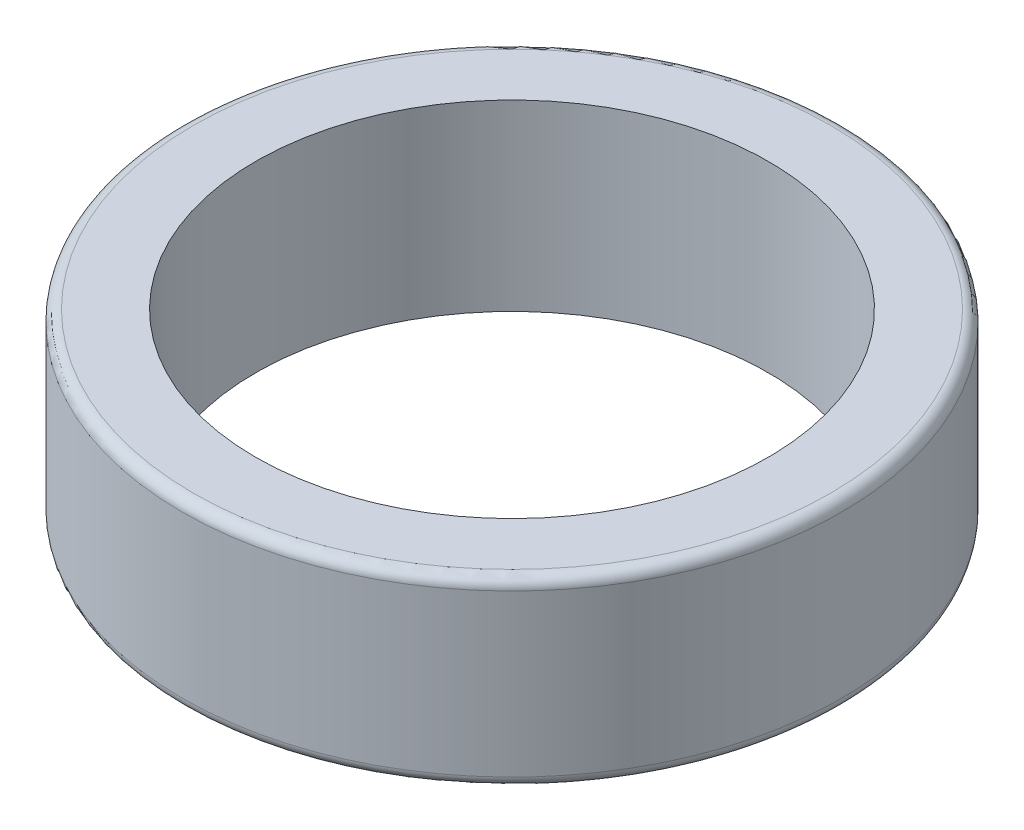
ISO-10303-21;
HEADER;
FILE_DESCRIPTION(('STEP AP214'),'2;1');
FILE_NAME('part.step','',(''),(''),'','','');
FILE_SCHEMA(('AUTOMOTIVE_DESIGN { 1 0 10303 214 1 1 1 1 }'));
ENDSEC;
DATA;
#1=APPLICATION_CONTEXT('core data for automotive mechanical design processes');
#2=APPLICATION_PROTOCOL_DEFINITION('international standard','automotive_design',2000,#1);
#3=PRODUCT_CONTEXT('',#1,'mechanical');
#4=PRODUCT('Part','Part','',(#3));
#5=PRODUCT_RELATED_PRODUCT_CATEGORY('part','',(#4));
#6=PRODUCT_DEFINITION_FORMATION('','',#4);
#7=PRODUCT_DEFINITION_CONTEXT('part definition',#1,'design');
#8=PRODUCT_DEFINITION('design','',#6,#7);
#9=PRODUCT_DEFINITION_SHAPE('','',#8);
#10=(LENGTH_UNIT() NAMED_UNIT(*) SI_UNIT(.MILLI.,.METRE.));
#11=(NAMED_UNIT(*) PLANE_ANGLE_UNIT() SI_UNIT($,.RADIAN.));
#12=(NAMED_UNIT(*) SI_UNIT($,.STERADIAN.) SOLID_ANGLE_UNIT());
#13=UNCERTAINTY_MEASURE_WITH_UNIT(LENGTH_MEASURE(1.E-05),#10,'distance_accuracy_value','');
#14=(GEOMETRIC_REPRESENTATION_CONTEXT(3) GLOBAL_UNCERTAINTY_ASSIGNED_CONTEXT((#13)) GLOBAL_UNIT_ASSIGNED_CONTEXT((#10,
#11,#12)) REPRESENTATION_CONTEXT('',''));
#15=CARTESIAN_POINT('',(0.,0.,0.));
#16=DIRECTION('',(0.,0.,1.));
#17=DIRECTION('',(1.,0.,0.));
#18=AXIS2_PLACEMENT_3D('',#15,#16,#17);
#19=CARTESIAN_POINT('',(0.,-25.,0.));
#20=DIRECTION('',(0.,1.,0.));
#21=DIRECTION('',(0.,0.,1.));
#22=AXIS2_PLACEMENT_3D('',#19,#20,#21);
#23=CYLINDRICAL_SURFACE('',#22,90.);
#24=CARTESIAN_POINT('',(0.,22.,0.));
#25=DIRECTION('',(0.,1.,0.));
#26=DIRECTION('',(0.,0.,1.));
#27=AXIS2_PLACEMENT_3D('',#24,#25,#26);
#28=CIRCLE('',#27,90.);
#29=CARTESIAN_POINT('',(0.,22.,90.));
#30=VERTEX_POINT('',#29);
#31=EDGE_CURVE('E45',#30,#30,#28,.F.);
#32=ORIENTED_EDGE('',*,*,#31,.T.);
#33=EDGE_LOOP('',(#32));
#34=FACE_BOUND('',#33,.T.);
#35=CARTESIAN_POINT('',(0.,-22.,0.));
#36=DIRECTION('',(0.,1.,0.));
#37=DIRECTION('',(0.,0.,1.));
#38=AXIS2_PLACEMENT_3D('',#35,#36,#37);
#39=CIRCLE('',#38,90.);
#40=CARTESIAN_POINT('',(0.,-22.,90.));
#41=VERTEX_POINT('',#40);
#42=EDGE_CURVE('E50',#41,#41,#39,.T.);
#43=ORIENTED_EDGE('',*,*,#42,.T.);
#44=EDGE_LOOP('',(#43));
#45=FACE_BOUND('',#44,.T.);
#46=ADVANCED_FACE('F37',(#34,#45),#23,.T.);
#47=CARTESIAN_POINT('',(0.,-25.,0.));
#48=DIRECTION('',(0.,1.,0.));
#49=DIRECTION('',(0.,0.,1.));
#50=AXIS2_PLACEMENT_3D('',#47,#48,#49);
#51=PLANE('',#50);
#52=CARTESIAN_POINT('',(0.,-25.,0.));
#53=DIRECTION('',(0.,1.,0.));
#54=DIRECTION('',(0.,0.,1.));
#55=AXIS2_PLACEMENT_3D('',#52,#53,#54);
#56=CIRCLE('',#55,87.);
#57=CARTESIAN_POINT('',(0.,-25.,87.));
#58=VERTEX_POINT('',#57);
#59=EDGE_CURVE('E10',#58,#58,#56,.F.);
#60=ORIENTED_EDGE('',*,*,#59,.T.);
#61=EDGE_LOOP('',(#60));
#62=FACE_BOUND('',#61,.T.);
#63=CARTESIAN_POINT('',(0.,-25.,0.));
#64=DIRECTION('',(0.,1.,0.));
#65=DIRECTION('',(0.,0.,1.));
#66=AXIS2_PLACEMENT_3D('',#63,#64,#65);
#67=CIRCLE('',#66,70.);
#68=CARTESIAN_POINT('',(0.,-25.,70.));
#69=VERTEX_POINT('',#68);
#70=EDGE_CURVE('E61',#69,#69,#67,.T.);
#71=ORIENTED_EDGE('',*,*,#70,.T.);
#72=EDGE_LOOP('',(#71));
#73=FACE_BOUND('',#72,.T.);
#74=ADVANCED_FACE('F82',(#62,#73),#51,.F.);
#75=CARTESIAN_POINT('',(0.,-25.,0.));
#76=DIRECTION('',(0.,1.,0.));
#77=DIRECTION('',(0.,0.,1.));
#78=AXIS2_PLACEMENT_3D('',#75,#76,#77);
#79=CYLINDRICAL_SURFACE('',#78,70.);
#80=ORIENTED_EDGE('',*,*,#70,.F.);
#81=EDGE_LOOP('',(#80));
#82=FACE_BOUND('',#81,.T.);
#83=CARTESIAN_POINT('',(0.,25.,0.));
#84=DIRECTION('',(0.,1.,0.));
#85=DIRECTION('',(0.,0.,1.));
#86=AXIS2_PLACEMENT_3D('',#83,#84,#85);
#87=CIRCLE('',#86,70.);
#88=CARTESIAN_POINT('',(0.,25.,70.));
#89=VERTEX_POINT('',#88);
#90=EDGE_CURVE('E65',#89,#89,#87,.T.);
#91=ORIENTED_EDGE('',*,*,#90,.T.);
#92=EDGE_LOOP('',(#91));
#93=FACE_BOUND('',#92,.T.);
#94=ADVANCED_FACE('F70',(#82,#93),#79,.F.);
#95=CARTESIAN_POINT('',(0.,25.,0.));
#96=DIRECTION('',(0.,1.,0.));
#97=DIRECTION('',(0.,0.,1.));
#98=AXIS2_PLACEMENT_3D('',#95,#96,#97);
#99=PLANE('',#98);
#100=CARTESIAN_POINT('',(0.,25.,0.));
#101=DIRECTION('',(0.,1.,0.));
#102=DIRECTION('',(0.,0.,1.));
#103=AXIS2_PLACEMENT_3D('',#100,#101,#102);
#104=CIRCLE('',#103,87.);
#105=CARTESIAN_POINT('',(0.,25.,87.));
#106=VERTEX_POINT('',#105);
#107=EDGE_CURVE('E55',#106,#106,#104,.T.);
#108=ORIENTED_EDGE('',*,*,#107,.T.);
#109=EDGE_LOOP('',(#108));
#110=FACE_BOUND('',#109,.T.);
#111=ORIENTED_EDGE('',*,*,#90,.F.);
#112=EDGE_LOOP('',(#111));
#113=FACE_BOUND('',#112,.T.);
#114=ADVANCED_FACE('F72',(#110,#113),#99,.T.);
#115=CARTESIAN_POINT('',(0.,22.,0.));
#116=DIRECTION('',(0.,1.,0.));
#117=DIRECTION('',(0.,0.,1.));
#118=AXIS2_PLACEMENT_3D('',#115,#116,#117);
#119=TOROIDAL_SURFACE('',#118,87.,3.);
#120=ORIENTED_EDGE('',*,*,#31,.F.);
#121=EDGE_LOOP('',(#120));
#122=FACE_BOUND('',#121,.T.);
#123=ORIENTED_EDGE('',*,*,#107,.F.);
#124=EDGE_LOOP('',(#123));
#125=FACE_BOUND('',#124,.T.);
#126=ADVANCED_FACE('F74',(#122,#125),#119,.T.);
#127=CARTESIAN_POINT('',(0.,-22.,0.));
#128=DIRECTION('',(0.,1.,0.));
#129=DIRECTION('',(0.,0.,1.));
#130=AXIS2_PLACEMENT_3D('',#127,#128,#129);
#131=TOROIDAL_SURFACE('',#130,87.,3.);
#132=ORIENTED_EDGE('',*,*,#59,.F.);
#133=EDGE_LOOP('',(#132));
#134=FACE_BOUND('',#133,.T.);
#135=ORIENTED_EDGE('',*,*,#42,.F.);
#136=EDGE_LOOP('',(#135));
#137=FACE_BOUND('',#136,.T.);
#138=ADVANCED_FACE('F39',(#134,#137),#131,.T.);
#139=CLOSED_SHELL('',(#46,#74,#94,#114,#126,#138));
#140=MANIFOLD_SOLID_BREP('B2',#139);
#141=ADVANCED_BREP_SHAPE_REPRESENTATION('',(#18,#140),#14);
#142=SHAPE_DEFINITION_REPRESENTATION(#9,#141);
ENDSEC;
END-ISO-10303-21;
